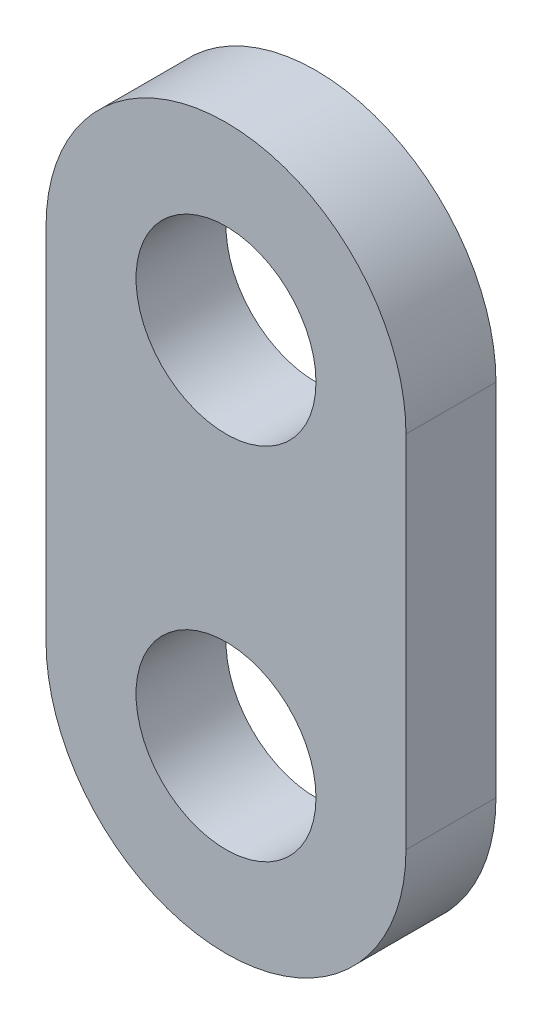
ISO-10303-21;
HEADER;
FILE_DESCRIPTION(('STEP AP214'),'2;1');
FILE_NAME('part.step','',(''),(''),'','','');
FILE_SCHEMA(('AUTOMOTIVE_DESIGN { 1 0 10303 214 1 1 1 1 }'));
ENDSEC;
DATA;
#1=APPLICATION_CONTEXT('core data for automotive mechanical design processes');
#2=APPLICATION_PROTOCOL_DEFINITION('international standard','automotive_design',2000,#1);
#3=PRODUCT_CONTEXT('',#1,'mechanical');
#4=PRODUCT('Part','Part','',(#3));
#5=PRODUCT_RELATED_PRODUCT_CATEGORY('part','',(#4));
#6=PRODUCT_DEFINITION_FORMATION('','',#4);
#7=PRODUCT_DEFINITION_CONTEXT('part definition',#1,'design');
#8=PRODUCT_DEFINITION('design','',#6,#7);
#9=PRODUCT_DEFINITION_SHAPE('','',#8);
#10=(LENGTH_UNIT() NAMED_UNIT(*) SI_UNIT(.MILLI.,.METRE.));
#11=(NAMED_UNIT(*) PLANE_ANGLE_UNIT() SI_UNIT($,.RADIAN.));
#12=(NAMED_UNIT(*) SI_UNIT($,.STERADIAN.) SOLID_ANGLE_UNIT());
#13=UNCERTAINTY_MEASURE_WITH_UNIT(LENGTH_MEASURE(1.E-05),#10,'distance_accuracy_value','');
#14=(GEOMETRIC_REPRESENTATION_CONTEXT(3) GLOBAL_UNCERTAINTY_ASSIGNED_CONTEXT((#13)) GLOBAL_UNIT_ASSIGNED_CONTEXT((#10,
#11,#12)) REPRESENTATION_CONTEXT('',''));
#15=CARTESIAN_POINT('',(0.,0.,0.));
#16=DIRECTION('',(0.,0.,1.));
#17=DIRECTION('',(1.,0.,0.));
#18=AXIS2_PLACEMENT_3D('',#15,#16,#17);
#19=CARTESIAN_POINT('',(0.,-50.,25.));
#20=DIRECTION('',(0.,0.,1.));
#21=DIRECTION('',(1.,0.,0.));
#22=AXIS2_PLACEMENT_3D('',#19,#20,#21);
#23=PLANE('',#22);
#24=CARTESIAN_POINT('',(0.,50.,25.));
#25=DIRECTION('',(0.,0.,1.));
#26=DIRECTION('',(1.,0.,0.));
#27=AXIS2_PLACEMENT_3D('',#24,#25,#26);
#28=CIRCLE('',#27,25.);
#29=CARTESIAN_POINT('',(25.,50.,25.));
#30=VERTEX_POINT('',#29);
#31=EDGE_CURVE('E99',#30,#30,#28,.T.);
#32=ORIENTED_EDGE('',*,*,#31,.F.);
#33=EDGE_LOOP('',(#32));
#34=FACE_BOUND('',#33,.T.);
#35=CARTESIAN_POINT('',(0.,-50.,25.));
#36=DIRECTION('',(0.,0.,1.));
#37=DIRECTION('',(1.,0.,0.));
#38=AXIS2_PLACEMENT_3D('',#35,#36,#37);
#39=CIRCLE('',#38,50.);
#40=CARTESIAN_POINT('',(-50.,-50.,25.));
#41=VERTEX_POINT('',#40);
#42=CARTESIAN_POINT('',(50.,-50.,25.));
#43=VERTEX_POINT('',#42);
#44=EDGE_CURVE('E84',#41,#43,#39,.T.);
#45=ORIENTED_EDGE('',*,*,#44,.T.);
#46=DIRECTION('',(0.,1.,0.));
#47=VECTOR('',#46,1.);
#48=CARTESIAN_POINT('',(50.,50.,25.));
#49=LINE('',#48,#47);
#50=CARTESIAN_POINT('',(50.,50.,25.));
#51=VERTEX_POINT('',#50);
#52=EDGE_CURVE('E79',#43,#51,#49,.T.);
#53=ORIENTED_EDGE('',*,*,#52,.T.);
#54=CARTESIAN_POINT('',(0.,50.,25.));
#55=DIRECTION('',(0.,0.,1.));
#56=DIRECTION('',(1.,0.,0.));
#57=AXIS2_PLACEMENT_3D('',#54,#55,#56);
#58=CIRCLE('',#57,50.);
#59=CARTESIAN_POINT('',(-50.,50.,25.));
#60=VERTEX_POINT('',#59);
#61=EDGE_CURVE('E82',#51,#60,#58,.T.);
#62=ORIENTED_EDGE('',*,*,#61,.T.);
#63=DIRECTION('',(0.,-1.,0.));
#64=VECTOR('',#63,1.);
#65=CARTESIAN_POINT('',(-50.,50.,25.));
#66=LINE('',#65,#64);
#67=EDGE_CURVE('E49',#60,#41,#66,.T.);
#68=ORIENTED_EDGE('',*,*,#67,.T.);
#69=EDGE_LOOP('',(#45,#53,#62,#68));
#70=FACE_BOUND('',#69,.T.);
#71=CARTESIAN_POINT('',(0.,-50.,25.));
#72=DIRECTION('',(0.,0.,1.));
#73=DIRECTION('',(1.,0.,0.));
#74=AXIS2_PLACEMENT_3D('',#71,#72,#73);
#75=CIRCLE('',#74,25.);
#76=CARTESIAN_POINT('',(25.,-50.,25.));
#77=VERTEX_POINT('',#76);
#78=EDGE_CURVE('E114',#77,#77,#75,.T.);
#79=ORIENTED_EDGE('',*,*,#78,.F.);
#80=EDGE_LOOP('',(#79));
#81=FACE_BOUND('',#80,.T.);
#82=ADVANCED_FACE('F32',(#34,#70,#81),#23,.T.);
#83=CARTESIAN_POINT('',(0.,-50.,0.));
#84=DIRECTION('',(0.,0.,1.));
#85=DIRECTION('',(1.,0.,0.));
#86=AXIS2_PLACEMENT_3D('',#83,#84,#85);
#87=PLANE('',#86);
#88=CARTESIAN_POINT('',(0.,-50.,0.));
#89=DIRECTION('',(0.,0.,1.));
#90=DIRECTION('',(1.,0.,0.));
#91=AXIS2_PLACEMENT_3D('',#88,#89,#90);
#92=CIRCLE('',#91,50.);
#93=CARTESIAN_POINT('',(-50.,-50.,0.));
#94=VERTEX_POINT('',#93);
#95=CARTESIAN_POINT('',(50.,-50.,0.));
#96=VERTEX_POINT('',#95);
#97=EDGE_CURVE('E96',#94,#96,#92,.T.);
#98=ORIENTED_EDGE('',*,*,#97,.F.);
#99=DIRECTION('',(0.,-1.,0.));
#100=VECTOR('',#99,1.);
#101=CARTESIAN_POINT('',(-50.,50.,0.));
#102=LINE('',#101,#100);
#103=CARTESIAN_POINT('',(-50.,50.,0.));
#104=VERTEX_POINT('',#103);
#105=EDGE_CURVE('E72',#104,#94,#102,.T.);
#106=ORIENTED_EDGE('',*,*,#105,.F.);
#107=CARTESIAN_POINT('',(0.,50.,0.));
#108=DIRECTION('',(0.,0.,1.));
#109=DIRECTION('',(1.,0.,0.));
#110=AXIS2_PLACEMENT_3D('',#107,#108,#109);
#111=CIRCLE('',#110,50.);
#112=CARTESIAN_POINT('',(50.,50.,0.));
#113=VERTEX_POINT('',#112);
#114=EDGE_CURVE('E66',#113,#104,#111,.T.);
#115=ORIENTED_EDGE('',*,*,#114,.F.);
#116=DIRECTION('',(0.,1.,0.));
#117=VECTOR('',#116,1.);
#118=CARTESIAN_POINT('',(50.,50.,0.));
#119=LINE('',#118,#117);
#120=EDGE_CURVE('E88',#96,#113,#119,.T.);
#121=ORIENTED_EDGE('',*,*,#120,.F.);
#122=EDGE_LOOP('',(#98,#106,#115,#121));
#123=FACE_BOUND('',#122,.T.);
#124=CARTESIAN_POINT('',(0.,50.,0.));
#125=DIRECTION('',(0.,0.,1.));
#126=DIRECTION('',(1.,0.,0.));
#127=AXIS2_PLACEMENT_3D('',#124,#125,#126);
#128=CIRCLE('',#127,25.);
#129=CARTESIAN_POINT('',(25.,50.,0.));
#130=VERTEX_POINT('',#129);
#131=EDGE_CURVE('E111',#130,#130,#128,.T.);
#132=ORIENTED_EDGE('',*,*,#131,.T.);
#133=EDGE_LOOP('',(#132));
#134=FACE_BOUND('',#133,.T.);
#135=CARTESIAN_POINT('',(0.,-50.,0.));
#136=DIRECTION('',(0.,0.,1.));
#137=DIRECTION('',(1.,0.,0.));
#138=AXIS2_PLACEMENT_3D('',#135,#136,#137);
#139=CIRCLE('',#138,25.);
#140=CARTESIAN_POINT('',(25.,-50.,0.));
#141=VERTEX_POINT('',#140);
#142=EDGE_CURVE('E117',#141,#141,#139,.T.);
#143=ORIENTED_EDGE('',*,*,#142,.T.);
#144=EDGE_LOOP('',(#143));
#145=FACE_BOUND('',#144,.T.);
#146=ADVANCED_FACE('F107',(#123,#134,#145),#87,.F.);
#147=CARTESIAN_POINT('',(0.,-50.,25.));
#148=DIRECTION('',(0.,0.,-1.));
#149=DIRECTION('',(-1.,0.,0.));
#150=AXIS2_PLACEMENT_3D('',#147,#148,#149);
#151=CYLINDRICAL_SURFACE('',#150,50.);
#152=ORIENTED_EDGE('',*,*,#97,.T.);
#153=DIRECTION('',(0.,0.,-1.));
#154=VECTOR('',#153,1.);
#155=CARTESIAN_POINT('',(50.,-50.,25.));
#156=LINE('',#155,#154);
#157=EDGE_CURVE('E11',#43,#96,#156,.T.);
#158=ORIENTED_EDGE('',*,*,#157,.F.);
#159=ORIENTED_EDGE('',*,*,#44,.F.);
#160=DIRECTION('',(0.,0.,-1.));
#161=VECTOR('',#160,1.);
#162=CARTESIAN_POINT('',(-50.,-50.,25.));
#163=LINE('',#162,#161);
#164=EDGE_CURVE('E92',#41,#94,#163,.T.);
#165=ORIENTED_EDGE('',*,*,#164,.T.);
#166=EDGE_LOOP('',(#152,#158,#159,#165));
#167=FACE_BOUND('',#166,.T.);
#168=ADVANCED_FACE('F34',(#167),#151,.T.);
#169=CARTESIAN_POINT('',(50.,50.,25.));
#170=DIRECTION('',(-1.,0.,0.));
#171=DIRECTION('',(0.,0.,1.));
#172=AXIS2_PLACEMENT_3D('',#169,#170,#171);
#173=PLANE('',#172);
#174=ORIENTED_EDGE('',*,*,#120,.T.);
#175=DIRECTION('',(0.,0.,-1.));
#176=VECTOR('',#175,1.);
#177=CARTESIAN_POINT('',(50.,50.,25.));
#178=LINE('',#177,#176);
#179=EDGE_CURVE('E41',#51,#113,#178,.T.);
#180=ORIENTED_EDGE('',*,*,#179,.F.);
#181=ORIENTED_EDGE('',*,*,#52,.F.);
#182=ORIENTED_EDGE('',*,*,#157,.T.);
#183=EDGE_LOOP('',(#174,#180,#181,#182));
#184=FACE_BOUND('',#183,.T.);
#185=ADVANCED_FACE('F87',(#184),#173,.F.);
#186=CARTESIAN_POINT('',(0.,50.,25.));
#187=DIRECTION('',(0.,0.,-1.));
#188=DIRECTION('',(-1.,0.,0.));
#189=AXIS2_PLACEMENT_3D('',#186,#187,#188);
#190=CYLINDRICAL_SURFACE('',#189,50.);
#191=ORIENTED_EDGE('',*,*,#114,.T.);
#192=DIRECTION('',(0.,0.,-1.));
#193=VECTOR('',#192,1.);
#194=CARTESIAN_POINT('',(-50.,50.,25.));
#195=LINE('',#194,#193);
#196=EDGE_CURVE('E89',#60,#104,#195,.T.);
#197=ORIENTED_EDGE('',*,*,#196,.F.);
#198=ORIENTED_EDGE('',*,*,#61,.F.);
#199=ORIENTED_EDGE('',*,*,#179,.T.);
#200=EDGE_LOOP('',(#191,#197,#198,#199));
#201=FACE_BOUND('',#200,.T.);
#202=ADVANCED_FACE('F90',(#201),#190,.T.);
#203=CARTESIAN_POINT('',(-50.,50.,25.));
#204=DIRECTION('',(1.,0.,0.));
#205=DIRECTION('',(0.,1.,0.));
#206=AXIS2_PLACEMENT_3D('',#203,#204,#205);
#207=PLANE('',#206);
#208=ORIENTED_EDGE('',*,*,#105,.T.);
#209=ORIENTED_EDGE('',*,*,#164,.F.);
#210=ORIENTED_EDGE('',*,*,#67,.F.);
#211=ORIENTED_EDGE('',*,*,#196,.T.);
#212=EDGE_LOOP('',(#208,#209,#210,#211));
#213=FACE_BOUND('',#212,.T.);
#214=ADVANCED_FACE('F104',(#213),#207,.F.);
#215=CARTESIAN_POINT('',(0.,50.,25.));
#216=DIRECTION('',(0.,0.,-1.));
#217=DIRECTION('',(-1.,0.,0.));
#218=AXIS2_PLACEMENT_3D('',#215,#216,#217);
#219=CYLINDRICAL_SURFACE('',#218,25.);
#220=ORIENTED_EDGE('',*,*,#31,.T.);
#221=EDGE_LOOP('',(#220));
#222=FACE_BOUND('',#221,.T.);
#223=ORIENTED_EDGE('',*,*,#131,.F.);
#224=EDGE_LOOP('',(#223));
#225=FACE_BOUND('',#224,.T.);
#226=ADVANCED_FACE('F134',(#222,#225),#219,.F.);
#227=CARTESIAN_POINT('',(0.,-50.,25.));
#228=DIRECTION('',(0.,0.,-1.));
#229=DIRECTION('',(-1.,0.,0.));
#230=AXIS2_PLACEMENT_3D('',#227,#228,#229);
#231=CYLINDRICAL_SURFACE('',#230,25.);
#232=ORIENTED_EDGE('',*,*,#78,.T.);
#233=EDGE_LOOP('',(#232));
#234=FACE_BOUND('',#233,.T.);
#235=ORIENTED_EDGE('',*,*,#142,.F.);
#236=EDGE_LOOP('',(#235));
#237=FACE_BOUND('',#236,.T.);
#238=ADVANCED_FACE('F123',(#234,#237),#231,.F.);
#239=CLOSED_SHELL('',(#82,#146,#168,#185,#202,#214,#226,#238));
#240=MANIFOLD_SOLID_BREP('B2',#239);
#241=ADVANCED_BREP_SHAPE_REPRESENTATION('',(#18,#240),#14);
#242=SHAPE_DEFINITION_REPRESENTATION(#9,#241);
ENDSEC;
END-ISO-10303-21;
